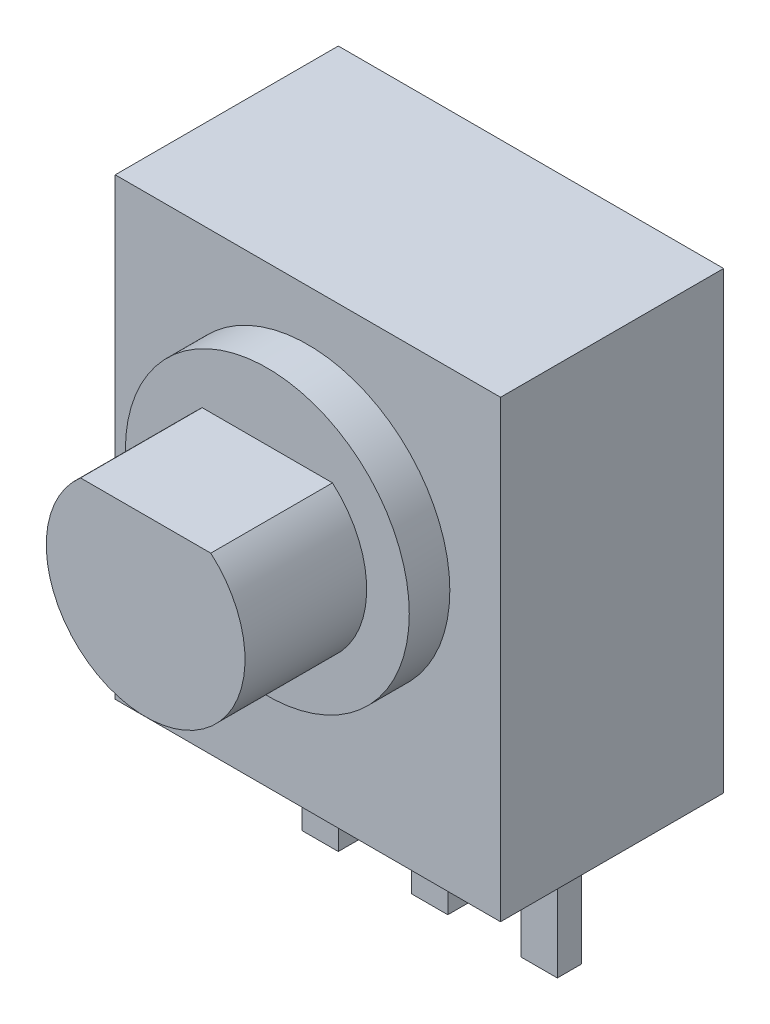
ISO-10303-21;
HEADER;
FILE_DESCRIPTION(('STEP AP214'),'2;1');
FILE_NAME('part.step','',(''),(''),'','','');
FILE_SCHEMA(('AUTOMOTIVE_DESIGN { 1 0 10303 214 1 1 1 1 }'));
ENDSEC;
DATA;
#1=APPLICATION_CONTEXT('core data for automotive mechanical design processes');
#2=APPLICATION_PROTOCOL_DEFINITION('international standard','automotive_design',2000,#1);
#3=PRODUCT_CONTEXT('',#1,'mechanical');
#4=PRODUCT('Part','Part','',(#3));
#5=PRODUCT_RELATED_PRODUCT_CATEGORY('part','',(#4));
#6=PRODUCT_DEFINITION_FORMATION('','',#4);
#7=PRODUCT_DEFINITION_CONTEXT('part definition',#1,'design');
#8=PRODUCT_DEFINITION('design','',#6,#7);
#9=PRODUCT_DEFINITION_SHAPE('','',#8);
#10=(LENGTH_UNIT() NAMED_UNIT(*) SI_UNIT(.MILLI.,.METRE.));
#11=(NAMED_UNIT(*) PLANE_ANGLE_UNIT() SI_UNIT($,.RADIAN.));
#12=(NAMED_UNIT(*) SI_UNIT($,.STERADIAN.) SOLID_ANGLE_UNIT());
#13=UNCERTAINTY_MEASURE_WITH_UNIT(LENGTH_MEASURE(1.E-05),#10,'distance_accuracy_value','');
#14=(GEOMETRIC_REPRESENTATION_CONTEXT(3) GLOBAL_UNCERTAINTY_ASSIGNED_CONTEXT((#13)) GLOBAL_UNIT_ASSIGNED_CONTEXT((#10,
#11,#12)) REPRESENTATION_CONTEXT('',''));
#15=CARTESIAN_POINT('',(0.,0.,0.));
#16=DIRECTION('',(0.,0.,1.));
#17=DIRECTION('',(1.,0.,0.));
#18=AXIS2_PLACEMENT_3D('',#15,#16,#17);
#19=CARTESIAN_POINT('',(0.,-6.45,0.));
#20=DIRECTION('',(0.,-1.,0.));
#21=DIRECTION('',(0.,0.,-1.));
#22=AXIS2_PLACEMENT_3D('',#19,#20,#21);
#23=PLANE('',#22);
#24=DIRECTION('',(0.,0.,-1.));
#25=VECTOR('',#24,1.);
#26=CARTESIAN_POINT('',(-4.75,-6.45,0.));
#27=LINE('',#26,#25);
#28=CARTESIAN_POINT('',(-4.75,-6.45,0.));
#29=VERTEX_POINT('',#28);
#30=CARTESIAN_POINT('',(-4.75,-6.45,-5.5));
#31=VERTEX_POINT('',#30);
#32=EDGE_CURVE('E265',#29,#31,#27,.T.);
#33=ORIENTED_EDGE('',*,*,#32,.T.);
#34=DIRECTION('',(1.,0.,0.));
#35=VECTOR('',#34,1.);
#36=CARTESIAN_POINT('',(-4.75,-6.45,-5.5));
#37=LINE('',#36,#35);
#38=CARTESIAN_POINT('',(4.75,-6.45,-5.5));
#39=VERTEX_POINT('',#38);
#40=EDGE_CURVE('E269',#31,#39,#37,.T.);
#41=ORIENTED_EDGE('',*,*,#40,.T.);
#42=DIRECTION('',(0.,0.,1.));
#43=VECTOR('',#42,1.);
#44=CARTESIAN_POINT('',(4.75,-6.45,0.));
#45=LINE('',#44,#43);
#46=CARTESIAN_POINT('',(4.75,-6.45,0.));
#47=VERTEX_POINT('',#46);
#48=EDGE_CURVE('E272',#39,#47,#45,.T.);
#49=ORIENTED_EDGE('',*,*,#48,.T.);
#50=DIRECTION('',(-1.,0.,0.));
#51=VECTOR('',#50,1.);
#52=CARTESIAN_POINT('',(-4.75,-6.45,0.));
#53=LINE('',#52,#51);
#54=EDGE_CURVE('E275',#47,#29,#53,.T.);
#55=ORIENTED_EDGE('',*,*,#54,.T.);
#56=EDGE_LOOP('',(#33,#41,#49,#55));
#57=FACE_BOUND('',#56,.T.);
#58=DIRECTION('',(1.,0.,0.));
#59=VECTOR('',#58,1.);
#60=CARTESIAN_POINT('',(-3.15,-6.45,-3.6));
#61=LINE('',#60,#59);
#62=CARTESIAN_POINT('',(-3.15,-6.45,-3.6));
#63=VERTEX_POINT('',#62);
#64=CARTESIAN_POINT('',(-2.25,-6.45,-3.6));
#65=VERTEX_POINT('',#64);
#66=EDGE_CURVE('E231',#63,#65,#61,.T.);
#67=ORIENTED_EDGE('',*,*,#66,.F.);
#68=DIRECTION('',(0.,0.,-1.));
#69=VECTOR('',#68,1.);
#70=CARTESIAN_POINT('',(-3.15,-6.45,-3.6));
#71=LINE('',#70,#69);
#72=CARTESIAN_POINT('',(-3.15,-6.45,-3.));
#73=VERTEX_POINT('',#72);
#74=EDGE_CURVE('E217',#73,#63,#71,.T.);
#75=ORIENTED_EDGE('',*,*,#74,.F.);
#76=DIRECTION('',(-1.,0.,0.));
#77=VECTOR('',#76,1.);
#78=CARTESIAN_POINT('',(-3.15,-6.45,-3.));
#79=LINE('',#78,#77);
#80=CARTESIAN_POINT('',(-2.25,-6.45,-3.));
#81=VERTEX_POINT('',#80);
#82=EDGE_CURVE('E222',#81,#73,#79,.T.);
#83=ORIENTED_EDGE('',*,*,#82,.F.);
#84=DIRECTION('',(0.,0.,1.));
#85=VECTOR('',#84,1.);
#86=CARTESIAN_POINT('',(-2.25,-6.45,-3.6));
#87=LINE('',#86,#85);
#88=EDGE_CURVE('E233',#65,#81,#87,.T.);
#89=ORIENTED_EDGE('',*,*,#88,.F.);
#90=EDGE_LOOP('',(#67,#75,#83,#89));
#91=FACE_BOUND('',#90,.T.);
#92=DIRECTION('',(0.,0.,1.));
#93=VECTOR('',#92,1.);
#94=CARTESIAN_POINT('',(0.450000000000001,-6.45,-3.6));
#95=LINE('',#94,#93);
#96=CARTESIAN_POINT('',(0.450000000000001,-6.45,-3.6));
#97=VERTEX_POINT('',#96);
#98=CARTESIAN_POINT('',(0.449999999999999,-6.45,-3.));
#99=VERTEX_POINT('',#98);
#100=EDGE_CURVE('E189',#97,#99,#95,.T.);
#101=ORIENTED_EDGE('',*,*,#100,.F.);
#102=DIRECTION('',(1.,0.,0.));
#103=VECTOR('',#102,1.);
#104=CARTESIAN_POINT('',(-0.449999999999999,-6.45,-3.6));
#105=LINE('',#104,#103);
#106=CARTESIAN_POINT('',(-0.449999999999999,-6.45,-3.6));
#107=VERTEX_POINT('',#106);
#108=EDGE_CURVE('E186',#107,#97,#105,.T.);
#109=ORIENTED_EDGE('',*,*,#108,.F.);
#110=DIRECTION('',(0.,0.,-1.));
#111=VECTOR('',#110,1.);
#112=CARTESIAN_POINT('',(-0.449999999999999,-6.45,-3.6));
#113=LINE('',#112,#111);
#114=CARTESIAN_POINT('',(-0.449999999999999,-6.45,-3.));
#115=VERTEX_POINT('',#114);
#116=EDGE_CURVE('E198',#115,#107,#113,.T.);
#117=ORIENTED_EDGE('',*,*,#116,.F.);
#118=DIRECTION('',(-1.,0.,0.));
#119=VECTOR('',#118,1.);
#120=CARTESIAN_POINT('',(-0.449999999999999,-6.45,-3.));
#121=LINE('',#120,#119);
#122=EDGE_CURVE('E206',#99,#115,#121,.T.);
#123=ORIENTED_EDGE('',*,*,#122,.F.);
#124=EDGE_LOOP('',(#101,#109,#117,#123));
#125=FACE_BOUND('',#124,.T.);
#126=DIRECTION('',(0.,0.,1.));
#127=VECTOR('',#126,1.);
#128=CARTESIAN_POINT('',(3.15,-6.45,-3.6));
#129=LINE('',#128,#127);
#130=CARTESIAN_POINT('',(3.15,-6.45,-3.6));
#131=VERTEX_POINT('',#130);
#132=CARTESIAN_POINT('',(3.15,-6.45,-3.));
#133=VERTEX_POINT('',#132);
#134=EDGE_CURVE('E570',#131,#133,#129,.T.);
#135=ORIENTED_EDGE('',*,*,#134,.F.);
#136=DIRECTION('',(1.,0.,0.));
#137=VECTOR('',#136,1.);
#138=CARTESIAN_POINT('',(2.25,-6.45,-3.6));
#139=LINE('',#138,#137);
#140=CARTESIAN_POINT('',(2.25,-6.45,-3.6));
#141=VERTEX_POINT('',#140);
#142=EDGE_CURVE('E184',#141,#131,#139,.T.);
#143=ORIENTED_EDGE('',*,*,#142,.F.);
#144=DIRECTION('',(0.,0.,-1.));
#145=VECTOR('',#144,1.);
#146=CARTESIAN_POINT('',(2.25,-6.45,-3.6));
#147=LINE('',#146,#145);
#148=CARTESIAN_POINT('',(2.25,-6.45,-3.));
#149=VERTEX_POINT('',#148);
#150=EDGE_CURVE('E180',#149,#141,#147,.T.);
#151=ORIENTED_EDGE('',*,*,#150,.F.);
#152=DIRECTION('',(-1.,0.,0.));
#153=VECTOR('',#152,1.);
#154=CARTESIAN_POINT('',(2.25,-6.45,-3.));
#155=LINE('',#154,#153);
#156=EDGE_CURVE('E567',#133,#149,#155,.T.);
#157=ORIENTED_EDGE('',*,*,#156,.F.);
#158=EDGE_LOOP('',(#135,#143,#151,#157));
#159=FACE_BOUND('',#158,.T.);
#160=ADVANCED_FACE('F33',(#57,#91,#125,#159),#23,.T.);
#161=CARTESIAN_POINT('',(4.75,-4.75,-5.5));
#162=DIRECTION('',(1.,0.,0.));
#163=DIRECTION('',(0.,0.,-1.));
#164=AXIS2_PLACEMENT_3D('',#161,#162,#163);
#165=PLANE('',#164);
#166=DIRECTION('',(0.,1.,0.));
#167=VECTOR('',#166,1.);
#168=CARTESIAN_POINT('',(4.75,-4.75,0.));
#169=LINE('',#168,#167);
#170=CARTESIAN_POINT('',(4.75,4.75,0.));
#171=VERTEX_POINT('',#170);
#172=EDGE_CURVE('E278',#47,#171,#169,.T.);
#173=ORIENTED_EDGE('',*,*,#172,.F.);
#174=ORIENTED_EDGE('',*,*,#48,.F.);
#175=DIRECTION('',(0.,1.,0.));
#176=VECTOR('',#175,1.);
#177=CARTESIAN_POINT('',(4.75,-4.75,-5.5));
#178=LINE('',#177,#176);
#179=CARTESIAN_POINT('',(4.75,4.75,-5.5));
#180=VERTEX_POINT('',#179);
#181=EDGE_CURVE('E279',#39,#180,#178,.T.);
#182=ORIENTED_EDGE('',*,*,#181,.T.);
#183=DIRECTION('',(0.,0.,1.));
#184=VECTOR('',#183,1.);
#185=CARTESIAN_POINT('',(4.75,4.75,-5.5));
#186=LINE('',#185,#184);
#187=EDGE_CURVE('E37',#180,#171,#186,.T.);
#188=ORIENTED_EDGE('',*,*,#187,.T.);
#189=EDGE_LOOP('',(#173,#174,#182,#188));
#190=FACE_BOUND('',#189,.T.);
#191=ADVANCED_FACE('F35',(#190),#165,.T.);
#192=CARTESIAN_POINT('',(-4.75,-4.75,-5.5));
#193=DIRECTION('',(-1.,0.,0.));
#194=DIRECTION('',(0.,0.,1.));
#195=AXIS2_PLACEMENT_3D('',#192,#193,#194);
#196=PLANE('',#195);
#197=DIRECTION('',(0.,-1.,0.));
#198=VECTOR('',#197,1.);
#199=CARTESIAN_POINT('',(-4.75,-4.75,0.));
#200=LINE('',#199,#198);
#201=CARTESIAN_POINT('',(-4.75,4.75,0.));
#202=VERTEX_POINT('',#201);
#203=EDGE_CURVE('E283',#202,#29,#200,.T.);
#204=ORIENTED_EDGE('',*,*,#203,.F.);
#205=DIRECTION('',(0.,0.,1.));
#206=VECTOR('',#205,1.);
#207=CARTESIAN_POINT('',(-4.75,4.75,-5.5));
#208=LINE('',#207,#206);
#209=CARTESIAN_POINT('',(-4.75,4.75,-5.5));
#210=VERTEX_POINT('',#209);
#211=EDGE_CURVE('E42',#210,#202,#208,.T.);
#212=ORIENTED_EDGE('',*,*,#211,.F.);
#213=DIRECTION('',(0.,-1.,0.));
#214=VECTOR('',#213,1.);
#215=CARTESIAN_POINT('',(-4.75,-4.75,-5.5));
#216=LINE('',#215,#214);
#217=EDGE_CURVE('E286',#210,#31,#216,.T.);
#218=ORIENTED_EDGE('',*,*,#217,.T.);
#219=ORIENTED_EDGE('',*,*,#32,.F.);
#220=EDGE_LOOP('',(#204,#212,#218,#219));
#221=FACE_BOUND('',#220,.T.);
#222=ADVANCED_FACE('F307',(#221),#196,.T.);
#223=CARTESIAN_POINT('',(-4.75,4.75,-5.5));
#224=DIRECTION('',(0.,1.,0.));
#225=DIRECTION('',(0.,0.,1.));
#226=AXIS2_PLACEMENT_3D('',#223,#224,#225);
#227=PLANE('',#226);
#228=DIRECTION('',(-1.,0.,0.));
#229=VECTOR('',#228,1.);
#230=CARTESIAN_POINT('',(-4.75,4.75,0.));
#231=LINE('',#230,#229);
#232=EDGE_CURVE('E290',#171,#202,#231,.T.);
#233=ORIENTED_EDGE('',*,*,#232,.F.);
#234=ORIENTED_EDGE('',*,*,#187,.F.);
#235=DIRECTION('',(-1.,0.,0.));
#236=VECTOR('',#235,1.);
#237=CARTESIAN_POINT('',(-4.75,4.75,-5.5));
#238=LINE('',#237,#236);
#239=EDGE_CURVE('E282',#180,#210,#238,.T.);
#240=ORIENTED_EDGE('',*,*,#239,.T.);
#241=ORIENTED_EDGE('',*,*,#211,.T.);
#242=EDGE_LOOP('',(#233,#234,#240,#241));
#243=FACE_BOUND('',#242,.T.);
#244=ADVANCED_FACE('F299',(#243),#227,.T.);
#245=CARTESIAN_POINT('',(0.,0.,-5.5));
#246=DIRECTION('',(0.,0.,-1.));
#247=DIRECTION('',(-1.,0.,0.));
#248=AXIS2_PLACEMENT_3D('',#245,#246,#247);
#249=PLANE('',#248);
#250=ORIENTED_EDGE('',*,*,#181,.F.);
#251=ORIENTED_EDGE('',*,*,#40,.F.);
#252=ORIENTED_EDGE('',*,*,#217,.F.);
#253=ORIENTED_EDGE('',*,*,#239,.F.);
#254=EDGE_LOOP('',(#250,#251,#252,#253));
#255=FACE_BOUND('',#254,.T.);
#256=ADVANCED_FACE('F311',(#255),#249,.T.);
#257=CARTESIAN_POINT('',(0.,0.,0.));
#258=DIRECTION('',(0.,0.,-1.));
#259=DIRECTION('',(-1.,0.,0.));
#260=AXIS2_PLACEMENT_3D('',#257,#258,#259);
#261=PLANE('',#260);
#262=CARTESIAN_POINT('',(0.,0.,0.));
#263=DIRECTION('',(0.,0.,1.));
#264=DIRECTION('',(1.,0.,0.));
#265=AXIS2_PLACEMENT_3D('',#262,#263,#264);
#266=CIRCLE('',#265,3.5);
#267=CARTESIAN_POINT('',(3.5,0.,0.));
#268=VERTEX_POINT('',#267);
#269=EDGE_CURVE('E11',#268,#268,#266,.T.);
#270=ORIENTED_EDGE('',*,*,#269,.F.);
#271=EDGE_LOOP('',(#270));
#272=FACE_BOUND('',#271,.T.);
#273=ORIENTED_EDGE('',*,*,#172,.T.);
#274=ORIENTED_EDGE('',*,*,#232,.T.);
#275=ORIENTED_EDGE('',*,*,#203,.T.);
#276=ORIENTED_EDGE('',*,*,#54,.F.);
#277=EDGE_LOOP('',(#273,#274,#275,#276));
#278=FACE_BOUND('',#277,.T.);
#279=ADVANCED_FACE('F302',(#272,#278),#261,.F.);
#280=CARTESIAN_POINT('',(0.,0.,1.));
#281=DIRECTION('',(0.,0.,-1.));
#282=DIRECTION('',(-1.,0.,0.));
#283=AXIS2_PLACEMENT_3D('',#280,#281,#282);
#284=CYLINDRICAL_SURFACE('',#283,3.5);
#285=CARTESIAN_POINT('',(0.,0.,1.));
#286=DIRECTION('',(0.,0.,1.));
#287=DIRECTION('',(1.,0.,0.));
#288=AXIS2_PLACEMENT_3D('',#285,#286,#287);
#289=CIRCLE('',#288,3.5);
#290=CARTESIAN_POINT('',(3.5,0.,1.));
#291=VERTEX_POINT('',#290);
#292=EDGE_CURVE('E263',#291,#291,#289,.T.);
#293=ORIENTED_EDGE('',*,*,#292,.F.);
#294=EDGE_LOOP('',(#293));
#295=FACE_BOUND('',#294,.T.);
#296=ORIENTED_EDGE('',*,*,#269,.T.);
#297=EDGE_LOOP('',(#296));
#298=FACE_BOUND('',#297,.T.);
#299=ADVANCED_FACE('F318',(#295,#298),#284,.T.);
#300=CARTESIAN_POINT('',(0.,0.,1.));
#301=DIRECTION('',(0.,0.,1.));
#302=DIRECTION('',(1.,0.,0.));
#303=AXIS2_PLACEMENT_3D('',#300,#301,#302);
#304=PLANE('',#303);
#305=CARTESIAN_POINT('',(0.,0.,1.));
#306=DIRECTION('',(0.,0.,1.));
#307=DIRECTION('',(1.,0.,0.));
#308=AXIS2_PLACEMENT_3D('',#305,#306,#307);
#309=CIRCLE('',#308,2.45);
#310=CARTESIAN_POINT('',(-1.6062378404209,1.85,1.));
#311=VERTEX_POINT('',#310);
#312=CARTESIAN_POINT('',(1.6062378404209,1.85,1.));
#313=VERTEX_POINT('',#312);
#314=EDGE_CURVE('E246',#311,#313,#309,.T.);
#315=ORIENTED_EDGE('',*,*,#314,.F.);
#316=DIRECTION('',(-1.,0.,0.));
#317=VECTOR('',#316,1.);
#318=CARTESIAN_POINT('',(-1.6062378404209,1.85,1.));
#319=LINE('',#318,#317);
#320=EDGE_CURVE('E251',#313,#311,#319,.T.);
#321=ORIENTED_EDGE('',*,*,#320,.F.);
#322=EDGE_LOOP('',(#315,#321));
#323=FACE_BOUND('',#322,.T.);
#324=ORIENTED_EDGE('',*,*,#292,.T.);
#325=EDGE_LOOP('',(#324));
#326=FACE_BOUND('',#325,.T.);
#327=ADVANCED_FACE('F329',(#323,#326),#304,.T.);
#328=CARTESIAN_POINT('',(0.,0.,4.));
#329=DIRECTION('',(0.,0.,-1.));
#330=DIRECTION('',(-1.,0.,0.));
#331=AXIS2_PLACEMENT_3D('',#328,#329,#330);
#332=CYLINDRICAL_SURFACE('',#331,2.45);
#333=ORIENTED_EDGE('',*,*,#314,.T.);
#334=DIRECTION('',(0.,0.,-1.));
#335=VECTOR('',#334,1.);
#336=CARTESIAN_POINT('',(1.6062378404209,1.85,4.));
#337=LINE('',#336,#335);
#338=CARTESIAN_POINT('',(1.6062378404209,1.85,4.));
#339=VERTEX_POINT('',#338);
#340=EDGE_CURVE('E260',#339,#313,#337,.T.);
#341=ORIENTED_EDGE('',*,*,#340,.F.);
#342=CARTESIAN_POINT('',(0.,0.,4.));
#343=DIRECTION('',(0.,0.,1.));
#344=DIRECTION('',(1.,0.,0.));
#345=AXIS2_PLACEMENT_3D('',#342,#343,#344);
#346=CIRCLE('',#345,2.45);
#347=CARTESIAN_POINT('',(-1.6062378404209,1.85,4.));
#348=VERTEX_POINT('',#347);
#349=EDGE_CURVE('E247',#348,#339,#346,.T.);
#350=ORIENTED_EDGE('',*,*,#349,.F.);
#351=DIRECTION('',(0.,0.,-1.));
#352=VECTOR('',#351,1.);
#353=CARTESIAN_POINT('',(-1.6062378404209,1.85,4.));
#354=LINE('',#353,#352);
#355=EDGE_CURVE('E253',#348,#311,#354,.T.);
#356=ORIENTED_EDGE('',*,*,#355,.T.);
#357=EDGE_LOOP('',(#333,#341,#350,#356));
#358=FACE_BOUND('',#357,.T.);
#359=ADVANCED_FACE('F333',(#358),#332,.T.);
#360=CARTESIAN_POINT('',(-1.6062378404209,1.85,4.));
#361=DIRECTION('',(0.,-1.,0.));
#362=DIRECTION('',(0.,0.,-1.));
#363=AXIS2_PLACEMENT_3D('',#360,#361,#362);
#364=PLANE('',#363);
#365=ORIENTED_EDGE('',*,*,#320,.T.);
#366=ORIENTED_EDGE('',*,*,#355,.F.);
#367=DIRECTION('',(-1.,0.,0.));
#368=VECTOR('',#367,1.);
#369=CARTESIAN_POINT('',(-1.6062378404209,1.85,4.));
#370=LINE('',#369,#368);
#371=EDGE_CURVE('E250',#339,#348,#370,.T.);
#372=ORIENTED_EDGE('',*,*,#371,.F.);
#373=ORIENTED_EDGE('',*,*,#340,.T.);
#374=EDGE_LOOP('',(#365,#366,#372,#373));
#375=FACE_BOUND('',#374,.T.);
#376=ADVANCED_FACE('F337',(#375),#364,.F.);
#377=CARTESIAN_POINT('',(0.,0.,4.));
#378=DIRECTION('',(0.,0.,1.));
#379=DIRECTION('',(1.,0.,0.));
#380=AXIS2_PLACEMENT_3D('',#377,#378,#379);
#381=PLANE('',#380);
#382=ORIENTED_EDGE('',*,*,#349,.T.);
#383=ORIENTED_EDGE('',*,*,#371,.T.);
#384=EDGE_LOOP('',(#382,#383));
#385=FACE_BOUND('',#384,.T.);
#386=ADVANCED_FACE('F341',(#385),#381,.T.);
#387=CARTESIAN_POINT('',(-3.15,-9.95,-3.6));
#388=DIRECTION('',(1.,0.,0.));
#389=DIRECTION('',(0.,0.,-1.));
#390=AXIS2_PLACEMENT_3D('',#387,#388,#389);
#391=PLANE('',#390);
#392=ORIENTED_EDGE('',*,*,#74,.T.);
#393=DIRECTION('',(0.,1.,0.));
#394=VECTOR('',#393,1.);
#395=CARTESIAN_POINT('',(-3.15,-9.95,-3.6));
#396=LINE('',#395,#394);
#397=CARTESIAN_POINT('',(-3.15,-9.95,-3.6));
#398=VERTEX_POINT('',#397);
#399=EDGE_CURVE('E244',#398,#63,#396,.T.);
#400=ORIENTED_EDGE('',*,*,#399,.F.);
#401=DIRECTION('',(0.,0.,-1.));
#402=VECTOR('',#401,1.);
#403=CARTESIAN_POINT('',(-3.15,-9.95,-3.6));
#404=LINE('',#403,#402);
#405=CARTESIAN_POINT('',(-3.15,-9.95,-3.));
#406=VERTEX_POINT('',#405);
#407=EDGE_CURVE('E218',#406,#398,#404,.T.);
#408=ORIENTED_EDGE('',*,*,#407,.F.);
#409=DIRECTION('',(0.,1.,0.));
#410=VECTOR('',#409,1.);
#411=CARTESIAN_POINT('',(-3.15,-9.95,-3.));
#412=LINE('',#411,#410);
#413=EDGE_CURVE('E228',#406,#73,#412,.T.);
#414=ORIENTED_EDGE('',*,*,#413,.T.);
#415=EDGE_LOOP('',(#392,#400,#408,#414));
#416=FACE_BOUND('',#415,.T.);
#417=ADVANCED_FACE('F345',(#416),#391,.F.);
#418=CARTESIAN_POINT('',(-3.15,-9.95,-3.6));
#419=DIRECTION('',(0.,0.,1.));
#420=DIRECTION('',(1.,0.,0.));
#421=AXIS2_PLACEMENT_3D('',#418,#419,#420);
#422=PLANE('',#421);
#423=ORIENTED_EDGE('',*,*,#66,.T.);
#424=DIRECTION('',(0.,1.,0.));
#425=VECTOR('',#424,1.);
#426=CARTESIAN_POINT('',(-2.25,-9.95,-3.6));
#427=LINE('',#426,#425);
#428=CARTESIAN_POINT('',(-2.25,-9.95,-3.6));
#429=VERTEX_POINT('',#428);
#430=EDGE_CURVE('E241',#429,#65,#427,.T.);
#431=ORIENTED_EDGE('',*,*,#430,.F.);
#432=DIRECTION('',(1.,0.,0.));
#433=VECTOR('',#432,1.);
#434=CARTESIAN_POINT('',(-3.15,-9.95,-3.6));
#435=LINE('',#434,#433);
#436=EDGE_CURVE('E221',#398,#429,#435,.T.);
#437=ORIENTED_EDGE('',*,*,#436,.F.);
#438=ORIENTED_EDGE('',*,*,#399,.T.);
#439=EDGE_LOOP('',(#423,#431,#437,#438));
#440=FACE_BOUND('',#439,.T.);
#441=ADVANCED_FACE('F349',(#440),#422,.F.);
#442=CARTESIAN_POINT('',(-2.25,-9.95,-3.6));
#443=DIRECTION('',(-1.,0.,0.));
#444=DIRECTION('',(0.,0.,1.));
#445=AXIS2_PLACEMENT_3D('',#442,#443,#444);
#446=PLANE('',#445);
#447=ORIENTED_EDGE('',*,*,#88,.T.);
#448=DIRECTION('',(0.,1.,0.));
#449=VECTOR('',#448,1.);
#450=CARTESIAN_POINT('',(-2.25,-9.95,-3.));
#451=LINE('',#450,#449);
#452=CARTESIAN_POINT('',(-2.25,-9.95,-3.));
#453=VERTEX_POINT('',#452);
#454=EDGE_CURVE('E239',#453,#81,#451,.T.);
#455=ORIENTED_EDGE('',*,*,#454,.F.);
#456=DIRECTION('',(0.,0.,1.));
#457=VECTOR('',#456,1.);
#458=CARTESIAN_POINT('',(-2.25,-9.95,-3.6));
#459=LINE('',#458,#457);
#460=EDGE_CURVE('E224',#429,#453,#459,.T.);
#461=ORIENTED_EDGE('',*,*,#460,.F.);
#462=ORIENTED_EDGE('',*,*,#430,.T.);
#463=EDGE_LOOP('',(#447,#455,#461,#462));
#464=FACE_BOUND('',#463,.T.);
#465=ADVANCED_FACE('F353',(#464),#446,.F.);
#466=CARTESIAN_POINT('',(-3.15,-9.95,-3.));
#467=DIRECTION('',(0.,0.,-1.));
#468=DIRECTION('',(-1.,0.,0.));
#469=AXIS2_PLACEMENT_3D('',#466,#467,#468);
#470=PLANE('',#469);
#471=ORIENTED_EDGE('',*,*,#82,.T.);
#472=ORIENTED_EDGE('',*,*,#413,.F.);
#473=DIRECTION('',(-1.,0.,0.));
#474=VECTOR('',#473,1.);
#475=CARTESIAN_POINT('',(-3.15,-9.95,-3.));
#476=LINE('',#475,#474);
#477=EDGE_CURVE('E226',#453,#406,#476,.T.);
#478=ORIENTED_EDGE('',*,*,#477,.F.);
#479=ORIENTED_EDGE('',*,*,#454,.T.);
#480=EDGE_LOOP('',(#471,#472,#478,#479));
#481=FACE_BOUND('',#480,.T.);
#482=ADVANCED_FACE('F357',(#481),#470,.F.);
#483=CARTESIAN_POINT('',(0.,-9.95,0.));
#484=DIRECTION('',(0.,1.,0.));
#485=DIRECTION('',(0.,0.,1.));
#486=AXIS2_PLACEMENT_3D('',#483,#484,#485);
#487=PLANE('',#486);
#488=ORIENTED_EDGE('',*,*,#407,.T.);
#489=ORIENTED_EDGE('',*,*,#436,.T.);
#490=ORIENTED_EDGE('',*,*,#460,.T.);
#491=ORIENTED_EDGE('',*,*,#477,.T.);
#492=EDGE_LOOP('',(#488,#489,#490,#491));
#493=FACE_BOUND('',#492,.T.);
#494=ADVANCED_FACE('F361',(#493),#487,.F.);
#495=CARTESIAN_POINT('',(-0.449999999999999,-9.95,-3.6));
#496=DIRECTION('',(0.,0.,1.));
#497=DIRECTION('',(1.,0.,0.));
#498=AXIS2_PLACEMENT_3D('',#495,#496,#497);
#499=PLANE('',#498);
#500=ORIENTED_EDGE('',*,*,#108,.T.);
#501=DIRECTION('',(0.,1.,0.));
#502=VECTOR('',#501,1.);
#503=CARTESIAN_POINT('',(0.450000000000001,-9.95,-3.6));
#504=LINE('',#503,#502);
#505=CARTESIAN_POINT('',(0.450000000000001,-9.95,-3.6));
#506=VERTEX_POINT('',#505);
#507=EDGE_CURVE('E215',#506,#97,#504,.T.);
#508=ORIENTED_EDGE('',*,*,#507,.F.);
#509=DIRECTION('',(1.,0.,0.));
#510=VECTOR('',#509,1.);
#511=CARTESIAN_POINT('',(-0.449999999999999,-9.95,-3.6));
#512=LINE('',#511,#510);
#513=CARTESIAN_POINT('',(-0.449999999999999,-9.95,-3.6));
#514=VERTEX_POINT('',#513);
#515=EDGE_CURVE('E194',#514,#506,#512,.T.);
#516=ORIENTED_EDGE('',*,*,#515,.F.);
#517=DIRECTION('',(0.,1.,0.));
#518=VECTOR('',#517,1.);
#519=CARTESIAN_POINT('',(-0.449999999999999,-9.95,-3.6));
#520=LINE('',#519,#518);
#521=EDGE_CURVE('E203',#514,#107,#520,.T.);
#522=ORIENTED_EDGE('',*,*,#521,.T.);
#523=EDGE_LOOP('',(#500,#508,#516,#522));
#524=FACE_BOUND('',#523,.T.);
#525=ADVANCED_FACE('F365',(#524),#499,.F.);
#526=CARTESIAN_POINT('',(0.450000000000001,-9.95,-3.6));
#527=DIRECTION('',(-1.,0.,0.));
#528=DIRECTION('',(0.,0.,1.));
#529=AXIS2_PLACEMENT_3D('',#526,#527,#528);
#530=PLANE('',#529);
#531=ORIENTED_EDGE('',*,*,#100,.T.);
#532=DIRECTION('',(0.,1.,0.));
#533=VECTOR('',#532,1.);
#534=CARTESIAN_POINT('',(0.449999999999999,-9.95,-3.));
#535=LINE('',#534,#533);
#536=CARTESIAN_POINT('',(0.449999999999999,-9.95,-3.));
#537=VERTEX_POINT('',#536);
#538=EDGE_CURVE('E212',#537,#99,#535,.T.);
#539=ORIENTED_EDGE('',*,*,#538,.F.);
#540=DIRECTION('',(0.,0.,1.));
#541=VECTOR('',#540,1.);
#542=CARTESIAN_POINT('',(0.450000000000001,-9.95,-3.6));
#543=LINE('',#542,#541);
#544=EDGE_CURVE('E197',#506,#537,#543,.T.);
#545=ORIENTED_EDGE('',*,*,#544,.F.);
#546=ORIENTED_EDGE('',*,*,#507,.T.);
#547=EDGE_LOOP('',(#531,#539,#545,#546));
#548=FACE_BOUND('',#547,.T.);
#549=ADVANCED_FACE('F369',(#548),#530,.F.);
#550=CARTESIAN_POINT('',(-0.449999999999999,-9.95,-3.));
#551=DIRECTION('',(0.,0.,-1.));
#552=DIRECTION('',(-1.,0.,0.));
#553=AXIS2_PLACEMENT_3D('',#550,#551,#552);
#554=PLANE('',#553);
#555=ORIENTED_EDGE('',*,*,#122,.T.);
#556=DIRECTION('',(0.,1.,0.));
#557=VECTOR('',#556,1.);
#558=CARTESIAN_POINT('',(-0.449999999999999,-9.95,-3.));
#559=LINE('',#558,#557);
#560=CARTESIAN_POINT('',(-0.449999999999999,-9.95,-3.));
#561=VERTEX_POINT('',#560);
#562=EDGE_CURVE('E58',#561,#115,#559,.T.);
#563=ORIENTED_EDGE('',*,*,#562,.F.);
#564=DIRECTION('',(-1.,0.,0.));
#565=VECTOR('',#564,1.);
#566=CARTESIAN_POINT('',(-0.449999999999999,-9.95,-3.));
#567=LINE('',#566,#565);
#568=EDGE_CURVE('E200',#537,#561,#567,.T.);
#569=ORIENTED_EDGE('',*,*,#568,.F.);
#570=ORIENTED_EDGE('',*,*,#538,.T.);
#571=EDGE_LOOP('',(#555,#563,#569,#570));
#572=FACE_BOUND('',#571,.T.);
#573=ADVANCED_FACE('F373',(#572),#554,.F.);
#574=CARTESIAN_POINT('',(-0.449999999999999,-9.95,-3.6));
#575=DIRECTION('',(1.,0.,0.));
#576=DIRECTION('',(0.,0.,-1.));
#577=AXIS2_PLACEMENT_3D('',#574,#575,#576);
#578=PLANE('',#577);
#579=ORIENTED_EDGE('',*,*,#116,.T.);
#580=ORIENTED_EDGE('',*,*,#521,.F.);
#581=DIRECTION('',(0.,0.,-1.));
#582=VECTOR('',#581,1.);
#583=CARTESIAN_POINT('',(-0.449999999999999,-9.95,-3.6));
#584=LINE('',#583,#582);
#585=EDGE_CURVE('E202',#561,#514,#584,.T.);
#586=ORIENTED_EDGE('',*,*,#585,.F.);
#587=ORIENTED_EDGE('',*,*,#562,.T.);
#588=EDGE_LOOP('',(#579,#580,#586,#587));
#589=FACE_BOUND('',#588,.T.);
#590=ADVANCED_FACE('F377',(#589),#578,.F.);
#591=CARTESIAN_POINT('',(0.,-9.95,0.));
#592=DIRECTION('',(0.,-1.,0.));
#593=DIRECTION('',(0.,0.,-1.));
#594=AXIS2_PLACEMENT_3D('',#591,#592,#593);
#595=PLANE('',#594);
#596=ORIENTED_EDGE('',*,*,#515,.T.);
#597=ORIENTED_EDGE('',*,*,#544,.T.);
#598=ORIENTED_EDGE('',*,*,#568,.T.);
#599=ORIENTED_EDGE('',*,*,#585,.T.);
#600=EDGE_LOOP('',(#596,#597,#598,#599));
#601=FACE_BOUND('',#600,.T.);
#602=ADVANCED_FACE('F381',(#601),#595,.T.);
#603=CARTESIAN_POINT('',(2.25,-9.95,-3.6));
#604=DIRECTION('',(0.,0.,1.));
#605=DIRECTION('',(1.,0.,0.));
#606=AXIS2_PLACEMENT_3D('',#603,#604,#605);
#607=PLANE('',#606);
#608=ORIENTED_EDGE('',*,*,#142,.T.);
#609=DIRECTION('',(0.,1.,0.));
#610=VECTOR('',#609,1.);
#611=CARTESIAN_POINT('',(3.15,-9.95,-3.6));
#612=LINE('',#611,#610);
#613=CARTESIAN_POINT('',(3.15,-9.95,-3.6));
#614=VERTEX_POINT('',#613);
#615=EDGE_CURVE('E165',#614,#131,#612,.T.);
#616=ORIENTED_EDGE('',*,*,#615,.F.);
#617=DIRECTION('',(1.,0.,0.));
#618=VECTOR('',#617,1.);
#619=CARTESIAN_POINT('',(2.25,-9.95,-3.6));
#620=LINE('',#619,#618);
#621=CARTESIAN_POINT('',(2.25,-9.95,-3.6));
#622=VERTEX_POINT('',#621);
#623=EDGE_CURVE('E172',#622,#614,#620,.T.);
#624=ORIENTED_EDGE('',*,*,#623,.F.);
#625=DIRECTION('',(0.,1.,0.));
#626=VECTOR('',#625,1.);
#627=CARTESIAN_POINT('',(2.25,-9.95,-3.6));
#628=LINE('',#627,#626);
#629=EDGE_CURVE('E564',#622,#141,#628,.T.);
#630=ORIENTED_EDGE('',*,*,#629,.T.);
#631=EDGE_LOOP('',(#608,#616,#624,#630));
#632=FACE_BOUND('',#631,.T.);
#633=ADVANCED_FACE('F182',(#632),#607,.F.);
#634=CARTESIAN_POINT('',(3.15,-9.95,-3.6));
#635=DIRECTION('',(-1.,0.,0.));
#636=DIRECTION('',(0.,0.,1.));
#637=AXIS2_PLACEMENT_3D('',#634,#635,#636);
#638=PLANE('',#637);
#639=ORIENTED_EDGE('',*,*,#134,.T.);
#640=DIRECTION('',(0.,1.,0.));
#641=VECTOR('',#640,1.);
#642=CARTESIAN_POINT('',(3.15,-9.95,-3.));
#643=LINE('',#642,#641);
#644=CARTESIAN_POINT('',(3.15,-9.95,-3.));
#645=VERTEX_POINT('',#644);
#646=EDGE_CURVE('E168',#645,#133,#643,.T.);
#647=ORIENTED_EDGE('',*,*,#646,.F.);
#648=DIRECTION('',(0.,0.,1.));
#649=VECTOR('',#648,1.);
#650=CARTESIAN_POINT('',(3.15,-9.95,-3.6));
#651=LINE('',#650,#649);
#652=EDGE_CURVE('E161',#614,#645,#651,.T.);
#653=ORIENTED_EDGE('',*,*,#652,.F.);
#654=ORIENTED_EDGE('',*,*,#615,.T.);
#655=EDGE_LOOP('',(#639,#647,#653,#654));
#656=FACE_BOUND('',#655,.T.);
#657=ADVANCED_FACE('F163',(#656),#638,.F.);
#658=CARTESIAN_POINT('',(2.25,-9.95,-3.));
#659=DIRECTION('',(0.,0.,-1.));
#660=DIRECTION('',(-1.,0.,0.));
#661=AXIS2_PLACEMENT_3D('',#658,#659,#660);
#662=PLANE('',#661);
#663=ORIENTED_EDGE('',*,*,#156,.T.);
#664=DIRECTION('',(0.,1.,0.));
#665=VECTOR('',#664,1.);
#666=CARTESIAN_POINT('',(2.25,-9.95,-3.));
#667=LINE('',#666,#665);
#668=CARTESIAN_POINT('',(2.25,-9.95,-3.));
#669=VERTEX_POINT('',#668);
#670=EDGE_CURVE('E50',#669,#149,#667,.T.);
#671=ORIENTED_EDGE('',*,*,#670,.F.);
#672=DIRECTION('',(-1.,0.,0.));
#673=VECTOR('',#672,1.);
#674=CARTESIAN_POINT('',(2.25,-9.95,-3.));
#675=LINE('',#674,#673);
#676=EDGE_CURVE('E171',#645,#669,#675,.T.);
#677=ORIENTED_EDGE('',*,*,#676,.F.);
#678=ORIENTED_EDGE('',*,*,#646,.T.);
#679=EDGE_LOOP('',(#663,#671,#677,#678));
#680=FACE_BOUND('',#679,.T.);
#681=ADVANCED_FACE('F389',(#680),#662,.F.);
#682=CARTESIAN_POINT('',(2.25,-9.95,-3.6));
#683=DIRECTION('',(1.,0.,0.));
#684=DIRECTION('',(0.,0.,-1.));
#685=AXIS2_PLACEMENT_3D('',#682,#683,#684);
#686=PLANE('',#685);
#687=ORIENTED_EDGE('',*,*,#150,.T.);
#688=ORIENTED_EDGE('',*,*,#629,.F.);
#689=DIRECTION('',(0.,0.,-1.));
#690=VECTOR('',#689,1.);
#691=CARTESIAN_POINT('',(2.25,-9.95,-3.6));
#692=LINE('',#691,#690);
#693=EDGE_CURVE('E176',#669,#622,#692,.T.);
#694=ORIENTED_EDGE('',*,*,#693,.F.);
#695=ORIENTED_EDGE('',*,*,#670,.T.);
#696=EDGE_LOOP('',(#687,#688,#694,#695));
#697=FACE_BOUND('',#696,.T.);
#698=ADVANCED_FACE('F392',(#697),#686,.F.);
#699=CARTESIAN_POINT('',(0.,-9.95,0.));
#700=DIRECTION('',(0.,-1.,0.));
#701=DIRECTION('',(0.,0.,-1.));
#702=AXIS2_PLACEMENT_3D('',#699,#700,#701);
#703=PLANE('',#702);
#704=ORIENTED_EDGE('',*,*,#623,.T.);
#705=ORIENTED_EDGE('',*,*,#652,.T.);
#706=ORIENTED_EDGE('',*,*,#676,.T.);
#707=ORIENTED_EDGE('',*,*,#693,.T.);
#708=EDGE_LOOP('',(#704,#705,#706,#707));
#709=FACE_BOUND('',#708,.T.);
#710=ADVANCED_FACE('F175',(#709),#703,.T.);
#711=CLOSED_SHELL('',(#160,#191,#222,#244,#256,#279,#299,#327,#359,#376,#386,#417,#441,#465,
#482,#494,#525,#549,#573,#590,#602,#633,#657,#681,#698,#710));
#712=MANIFOLD_SOLID_BREP('B2',#711);
#713=ADVANCED_BREP_SHAPE_REPRESENTATION('',(#18,#712),#14);
#714=SHAPE_DEFINITION_REPRESENTATION(#9,#713);
ENDSEC;
END-ISO-10303-21;
